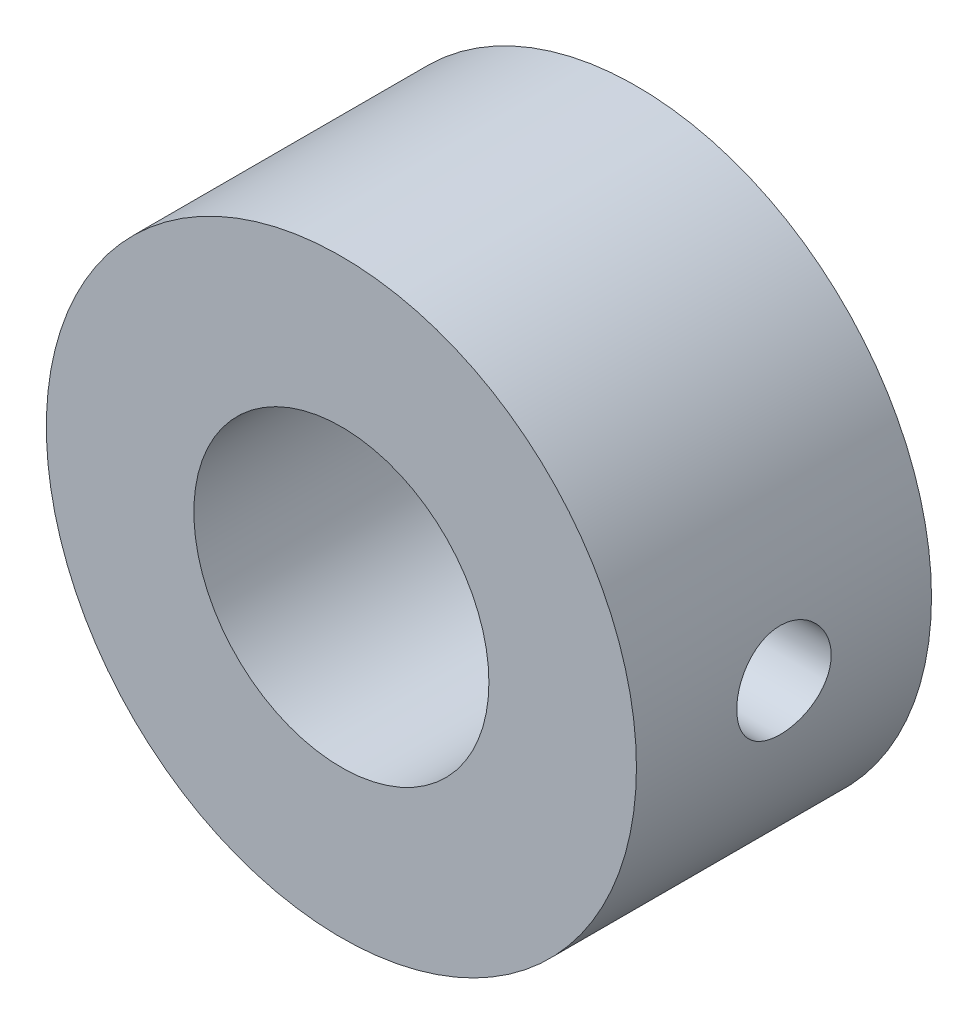
ISO-10303-21;
HEADER;
FILE_DESCRIPTION(('STEP AP214'),'2;1');
FILE_NAME('part.step','',(''),(''),'','','');
FILE_SCHEMA(('AUTOMOTIVE_DESIGN { 1 0 10303 214 1 1 1 1 }'));
ENDSEC;
DATA;
#1=APPLICATION_CONTEXT('core data for automotive mechanical design processes');
#2=APPLICATION_PROTOCOL_DEFINITION('international standard','automotive_design',2000,#1);
#3=PRODUCT_CONTEXT('',#1,'mechanical');
#4=PRODUCT('Part','Part','',(#3));
#5=PRODUCT_RELATED_PRODUCT_CATEGORY('part','',(#4));
#6=PRODUCT_DEFINITION_FORMATION('','',#4);
#7=PRODUCT_DEFINITION_CONTEXT('part definition',#1,'design');
#8=PRODUCT_DEFINITION('design','',#6,#7);
#9=PRODUCT_DEFINITION_SHAPE('','',#8);
#10=(LENGTH_UNIT() NAMED_UNIT(*) SI_UNIT(.MILLI.,.METRE.));
#11=(NAMED_UNIT(*) PLANE_ANGLE_UNIT() SI_UNIT($,.RADIAN.));
#12=(NAMED_UNIT(*) SI_UNIT($,.STERADIAN.) SOLID_ANGLE_UNIT());
#13=UNCERTAINTY_MEASURE_WITH_UNIT(LENGTH_MEASURE(1.E-05),#10,'distance_accuracy_value','');
#14=(GEOMETRIC_REPRESENTATION_CONTEXT(3) GLOBAL_UNCERTAINTY_ASSIGNED_CONTEXT((#13)) GLOBAL_UNIT_ASSIGNED_CONTEXT((#10,
#11,#12)) REPRESENTATION_CONTEXT('',''));
#15=CARTESIAN_POINT('',(0.,0.,0.));
#16=DIRECTION('',(0.,0.,1.));
#17=DIRECTION('',(1.,0.,0.));
#18=AXIS2_PLACEMENT_3D('',#15,#16,#17);
#19=CARTESIAN_POINT('',(0.,0.,2.5));
#20=DIRECTION('',(0.,0.,1.));
#21=DIRECTION('',(1.,0.,0.));
#22=AXIS2_PLACEMENT_3D('',#19,#20,#21);
#23=PLANE('',#22);
#24=CARTESIAN_POINT('',(0.,0.,2.5));
#25=DIRECTION('',(0.,0.,1.));
#26=DIRECTION('',(1.,0.,0.));
#27=AXIS2_PLACEMENT_3D('',#24,#25,#26);
#28=CIRCLE('',#27,5.);
#29=CARTESIAN_POINT('',(5.,0.,2.5));
#30=VERTEX_POINT('',#29);
#31=EDGE_CURVE('E47',#30,#30,#28,.T.);
#32=ORIENTED_EDGE('',*,*,#31,.T.);
#33=EDGE_LOOP('',(#32));
#34=FACE_BOUND('',#33,.T.);
#35=CARTESIAN_POINT('',(0.,0.,2.5));
#36=DIRECTION('',(0.,0.,1.));
#37=DIRECTION('',(1.,0.,0.));
#38=AXIS2_PLACEMENT_3D('',#35,#36,#37);
#39=CIRCLE('',#38,2.5);
#40=CARTESIAN_POINT('',(2.5,0.,2.5));
#41=VERTEX_POINT('',#40);
#42=EDGE_CURVE('E56',#41,#41,#39,.T.);
#43=ORIENTED_EDGE('',*,*,#42,.F.);
#44=EDGE_LOOP('',(#43));
#45=FACE_BOUND('',#44,.T.);
#46=ADVANCED_FACE('F35',(#34,#45),#23,.T.);
#47=CARTESIAN_POINT('',(0.,0.,-2.5));
#48=DIRECTION('',(0.,0.,1.));
#49=DIRECTION('',(1.,0.,0.));
#50=AXIS2_PLACEMENT_3D('',#47,#48,#49);
#51=PLANE('',#50);
#52=CARTESIAN_POINT('',(0.,0.,-2.5));
#53=DIRECTION('',(0.,0.,1.));
#54=DIRECTION('',(1.,0.,0.));
#55=AXIS2_PLACEMENT_3D('',#52,#53,#54);
#56=CIRCLE('',#55,5.);
#57=CARTESIAN_POINT('',(5.,0.,-2.5));
#58=VERTEX_POINT('',#57);
#59=EDGE_CURVE('E51',#58,#58,#56,.T.);
#60=ORIENTED_EDGE('',*,*,#59,.F.);
#61=EDGE_LOOP('',(#60));
#62=FACE_BOUND('',#61,.T.);
#63=CARTESIAN_POINT('',(0.,0.,-2.5));
#64=DIRECTION('',(0.,0.,1.));
#65=DIRECTION('',(1.,0.,0.));
#66=AXIS2_PLACEMENT_3D('',#63,#64,#65);
#67=CIRCLE('',#66,2.5);
#68=CARTESIAN_POINT('',(2.5,0.,-2.5));
#69=VERTEX_POINT('',#68);
#70=EDGE_CURVE('E58',#69,#69,#67,.T.);
#71=ORIENTED_EDGE('',*,*,#70,.T.);
#72=EDGE_LOOP('',(#71));
#73=FACE_BOUND('',#72,.T.);
#74=ADVANCED_FACE('F83',(#62,#73),#51,.F.);
#75=CARTESIAN_POINT('',(0.,0.,2.5));
#76=DIRECTION('',(0.,0.,-1.));
#77=DIRECTION('',(-1.,0.,0.));
#78=AXIS2_PLACEMENT_3D('',#75,#76,#77);
#79=CYLINDRICAL_SURFACE('',#78,5.);
#80=CARTESIAN_POINT('',(5.,0.,0.799999999999993));
#81=CARTESIAN_POINT('',(4.99999925368398,0.0446308080511731,0.799998188547922));
#82=CARTESIAN_POINT('',(4.99939618705492,0.089286609544133,0.796252557082731));
#83=CARTESIAN_POINT('',(4.99704849367426,0.177347511863294,0.781374220920801));
#84=CARTESIAN_POINT('',(4.99530279172417,0.220751394454068,0.770234558439937));
#85=CARTESIAN_POINT('',(4.99086578560516,0.305021508450513,0.740911647821589));
#86=CARTESIAN_POINT('',(4.98817523095935,0.3458897211776,0.722733981551678));
#87=CARTESIAN_POINT('',(4.98214495920462,0.423990337738182,0.679865282240881));
#88=CARTESIAN_POINT('',(4.97880532288342,0.461223193179569,0.655175059646541));
#89=CARTESIAN_POINT('',(4.97181457161351,0.531330998418692,0.599749758295024));
#90=CARTESIAN_POINT('',(4.96816120177215,0.564169146610383,0.568968408421929));
#91=CARTESIAN_POINT('',(4.96097215963753,0.624237641135127,0.502334213090008));
#92=CARTESIAN_POINT('',(4.95743649450599,0.651467646762831,0.466481059732526));
#93=CARTESIAN_POINT('',(4.95086133431278,0.69969266165285,0.390470445539169));
#94=CARTESIAN_POINT('',(4.94782475339399,0.72065159938438,0.350289825055355));
#95=CARTESIAN_POINT('',(4.9426226637982,0.75550892385042,0.266921734852475));
#96=CARTESIAN_POINT('',(4.94045710100136,0.76940774927203,0.223734452145009));
#97=CARTESIAN_POINT('',(4.93726457896946,0.789635034725304,0.135967849254072));
#98=CARTESIAN_POINT('',(4.93622810120145,0.796026817801594,0.091403475619989));
#99=CARTESIAN_POINT('',(4.93538226863645,0.8012548453503,0.00182360516582402));
#100=CARTESIAN_POINT('',(4.93557283377695,0.800091582776763,-0.0431918620298014));
#101=CARTESIAN_POINT('',(4.93715085922415,0.790294188232532,-0.131946012199573));
#102=CARTESIAN_POINT('',(4.93852696316707,0.781730938905651,-0.175692750944414));
#103=CARTESIAN_POINT('',(4.94230325280695,0.757487774055355,-0.261120428439182));
#104=CARTESIAN_POINT('',(4.944703471104,0.74180763198268,-0.302801301380358));
#105=CARTESIAN_POINT('',(4.95026992730641,0.70370315498882,-0.383127707142337));
#106=CARTESIAN_POINT('',(4.95343952372276,0.681249143270032,-0.421758919874148));
#107=CARTESIAN_POINT('',(4.96018523245969,0.630255410529446,-0.49473210867413));
#108=CARTESIAN_POINT('',(4.96376137506045,0.601715236062142,-0.52907376484927));
#109=CARTESIAN_POINT('',(4.97096724981016,0.538971936351564,-0.592903520174933));
#110=CARTESIAN_POINT('',(4.97459712801084,0.504707942182392,-0.62233180282751));
#111=CARTESIAN_POINT('',(4.98146370833866,0.431696149872206,-0.675029895537198));
#112=CARTESIAN_POINT('',(4.98470040828701,0.392948326886549,-0.698299671468023));
#113=CARTESIAN_POINT('',(4.99042002279776,0.312014355323645,-0.738024671245587));
#114=CARTESIAN_POINT('',(4.99290238302826,0.26982570696861,-0.75447488690754));
#115=CARTESIAN_POINT('',(4.9968291023744,0.183235933575907,-0.780039743170398));
#116=CARTESIAN_POINT('',(4.99827354143846,0.138834979228291,-0.789154948774821));
#117=CARTESIAN_POINT('',(4.99995098582024,0.0495968221607872,-0.799710588005176));
#118=CARTESIAN_POINT('',(5.00019695987027,0.00476957346417478,-0.801233186383058));
#119=CARTESIAN_POINT('',(4.99948519003732,-0.0844997486044568,-0.796779047356288));
#120=CARTESIAN_POINT('',(4.9985274887222,-0.128941835541714,-0.790802575155455));
#121=CARTESIAN_POINT('',(4.99552400060935,-0.215927519294201,-0.771588280724297));
#122=CARTESIAN_POINT('',(4.99348427121022,-0.258480269760831,-0.758390869878175));
#123=CARTESIAN_POINT('',(4.98854458459104,-0.340769196234395,-0.725152212587975));
#124=CARTESIAN_POINT('',(4.98564458225813,-0.380505224396474,-0.705110607224756));
#125=CARTESIAN_POINT('',(4.97927408607371,-0.456391460451544,-0.65856240027867));
#126=CARTESIAN_POINT('',(4.97579911023324,-0.492509601238277,-0.632004145590766));
#127=CARTESIAN_POINT('',(4.96867838165483,-0.559805662558109,-0.57324793825499));
#128=CARTESIAN_POINT('',(4.96503261755335,-0.590983253761126,-0.541049609948693));
#129=CARTESIAN_POINT('',(4.95793961092294,-0.647815466119997,-0.471559844758413));
#130=CARTESIAN_POINT('',(4.95449458581512,-0.673414749658874,-0.434222888485269));
#131=CARTESIAN_POINT('',(4.94823364120698,-0.717977956840472,-0.355730487551863));
#132=CARTESIAN_POINT('',(4.94541770293382,-0.736942078495335,-0.314575156889158));
#133=CARTESIAN_POINT('',(4.94075016481912,-0.76761263341661,-0.229773216312712));
#134=CARTESIAN_POINT('',(4.9388948235089,-0.779347259610058,-0.186137018160851));
#135=CARTESIAN_POINT('',(4.93634892888289,-0.795314874217832,-0.0974809720031934));
#136=CARTESIAN_POINT('',(4.93565828296954,-0.799548458993811,-0.0524612342836637));
#137=CARTESIAN_POINT('',(4.93552375034277,-0.80037818647357,0.0371317973746478));
#138=CARTESIAN_POINT('',(4.93606565128661,-0.797061391285779,0.0817042878159039));
#139=CARTESIAN_POINT('',(4.93830411303284,-0.783072071891894,0.169648529050889));
#140=CARTESIAN_POINT('',(4.9400006709115,-0.772399566311442,0.213020282884755));
#141=CARTESIAN_POINT('',(4.94435206344804,-0.744034087420246,0.297302140006585));
#142=CARTESIAN_POINT('',(4.94700595372412,-0.726348031080528,0.338214623056524));
#143=CARTESIAN_POINT('',(4.95297399069632,-0.684466309136969,0.416505787069226));
#144=CARTESIAN_POINT('',(4.95628816589566,-0.660270362498023,0.453884315375289));
#145=CARTESIAN_POINT('',(4.96324867230805,-0.605742654398702,0.524487432334613));
#146=CARTESIAN_POINT('',(4.96689824087121,-0.575346658323831,0.557662099160161));
#147=CARTESIAN_POINT('',(4.97409200519902,-0.509417337431806,0.618470152559004));
#148=CARTESIAN_POINT('',(4.97763617638799,-0.473882825608014,0.646102255259478));
#149=CARTESIAN_POINT('',(4.9842456225166,-0.39841933863093,0.69519898646872));
#150=CARTESIAN_POINT('',(4.98730773061183,-0.358464019917935,0.716623549554953));
#151=CARTESIAN_POINT('',(4.99257715001872,-0.27549006678746,0.752424517159625));
#152=CARTESIAN_POINT('',(4.99478532624932,-0.232474584483899,0.766808057241583));
#153=CARTESIAN_POINT('',(4.99760702358556,-0.157734207535214,0.784938295494183));
#154=CARTESIAN_POINT('',(4.9984996711327,-0.126465390999475,0.790577561117113));
#155=CARTESIAN_POINT('',(4.99969642026856,-0.0634685920606806,0.798109029145436));
#156=CARTESIAN_POINT('',(5.00000053076634,-0.0317406166155306,0.800001288271665));
#157=CARTESIAN_POINT('',(5.,0.,0.799999999999993));
#158=B_SPLINE_CURVE_WITH_KNOTS('',3,(#80,#81,#82,#83,#84,#85,#86,#87,#88,#89,#90,#91,#92,#93,
#94,#95,#96,#97,#98,#99,#100,#101,#102,#103,#104,#105,#106,#107,#108,#109,#110,#111,#112,#113,
#114,#115,#116,#117,#118,#119,#120,#121,#122,#123,#124,#125,#126,#127,#128,#129,#130,#131,#132,
#133,#134,#135,#136,#137,#138,#139,#140,#141,#142,#143,#144,#145,#146,#147,#148,#149,#150,#151,
#152,#153,#154,#155,#156,#157),.UNSPECIFIED.,.T.,.F.,(4,2,2,2,2,2,2,2,2,2,2,2,2,2,2,2,2,2,2,2,2,
2,2,2,2,2,2,2,2,2,2,2,2,2,2,2,2,2,4),(0.,0.133776418649177,0.267678899727785,0.401475399062738,
0.535255256116411,0.67009333843293,0.804939610005115,0.940547238503773,1.07614643985654,
1.21059343387859,1.34503165554809,1.47819622356199,1.61136503084876,1.74512594827326,
1.87889683494992,2.01419325334954,2.14949042145486,2.28488677454406,2.42027269728076,
2.55419028860043,2.68810314407251,2.82127412090817,2.954452082489,3.08872183713535,
3.22300053825305,3.35855610834639,3.49410763273005,3.62912714304123,3.76413591830007,
3.89759582738453,4.0310553985319,4.16438367394701,4.2977177061319,4.43251052341615,
4.5673345279789,4.7030102746009,4.83854823761402,4.9336890266799,5.02882837552775),.UNSPECIFIED.);
#159=CARTESIAN_POINT('',(5.,0.,0.799999999999993));
#160=VERTEX_POINT('',#159);
#161=EDGE_CURVE('E10',#160,#160,#158,.T.);
#162=ORIENTED_EDGE('',*,*,#161,.T.);
#163=EDGE_LOOP('',(#162));
#164=FACE_BOUND('',#163,.T.);
#165=ORIENTED_EDGE('',*,*,#31,.F.);
#166=EDGE_LOOP('',(#165));
#167=FACE_BOUND('',#166,.T.);
#168=ORIENTED_EDGE('',*,*,#59,.T.);
#169=EDGE_LOOP('',(#168));
#170=FACE_BOUND('',#169,.T.);
#171=ADVANCED_FACE('F37',(#164,#167,#170),#79,.T.);
#172=CARTESIAN_POINT('',(0.,0.,2.5));
#173=DIRECTION('',(0.,0.,-1.));
#174=DIRECTION('',(-1.,0.,0.));
#175=AXIS2_PLACEMENT_3D('',#172,#173,#174);
#176=CYLINDRICAL_SURFACE('',#175,2.5);
#177=CARTESIAN_POINT('',(2.5,0.,0.799999999999993));
#178=CARTESIAN_POINT('',(2.49999989271814,0.0437479031579896,0.799999878174701));
#179=CARTESIAN_POINT('',(2.4988409207818,0.0874973185295298,0.796399702360364));
#180=CARTESIAN_POINT('',(2.49433131086111,0.17371345061874,0.782134090235364));
#181=CARTESIAN_POINT('',(2.4909802727677,0.216179931686852,0.771467364091042));
#182=CARTESIAN_POINT('',(2.48245191817715,0.298574612895781,0.743467539394104));
#183=CARTESIAN_POINT('',(2.47727751022632,0.338506736692297,0.726145053814677));
#184=CARTESIAN_POINT('',(2.465634508214,0.414899381425573,0.685371584956378));
#185=CARTESIAN_POINT('',(2.45916569150058,0.451359303512461,0.661919547117244));
#186=CARTESIAN_POINT('',(2.44538533967052,0.520947378897494,0.608757943247923));
#187=CARTESIAN_POINT('',(2.43805478866985,0.553948046123227,0.578886450523072));
#188=CARTESIAN_POINT('',(2.42348532851009,0.614567118466103,0.514078466726504));
#189=CARTESIAN_POINT('',(2.41624643774199,0.642184458968865,0.479140976173354));
#190=CARTESIAN_POINT('',(2.40247405401532,0.691956975369269,0.40407357274399));
#191=CARTESIAN_POINT('',(2.39596392825326,0.713950615550156,0.36383185936165));
#192=CARTESIAN_POINT('',(2.38467328891707,0.750804585672501,0.279978828118017));
#193=CARTESIAN_POINT('',(2.37989229455565,0.765666898864973,0.236368451017323));
#194=CARTESIAN_POINT('',(2.3728006140792,0.787365671556013,0.14845869636131));
#195=CARTESIAN_POINT('',(2.37041707567794,0.794439484234909,0.104223949101231));
#196=CARTESIAN_POINT('',(2.3681741562335,0.801102165297518,0.0151362003803353));
#197=CARTESIAN_POINT('',(2.3683140664017,0.800693135468622,-0.029716623937612));
#198=CARTESIAN_POINT('',(2.37103809524654,0.79258690368103,-0.116782792441988));
#199=CARTESIAN_POINT('',(2.37352008708405,0.785194210663384,-0.159028226721779));
#200=CARTESIAN_POINT('',(2.38048228729887,0.763825294870921,-0.241644422211601));
#201=CARTESIAN_POINT('',(2.38496271746849,0.749848341346692,-0.282014974792752));
#202=CARTESIAN_POINT('',(2.39549327079956,0.715498225793991,-0.360448929412712));
#203=CARTESIAN_POINT('',(2.40156614734181,0.695031365518589,-0.398468109975693));
#204=CARTESIAN_POINT('',(2.41458722431085,0.648347471670349,-0.470631021513422));
#205=CARTESIAN_POINT('',(2.42153566107407,0.622128884135773,-0.504773701371776));
#206=CARTESIAN_POINT('',(2.43593186070792,0.563202757701924,-0.569932336433125));
#207=CARTESIAN_POINT('',(2.44338760404052,0.530244681247005,-0.600720388469399));
#208=CARTESIAN_POINT('',(2.45766584057477,0.459540716108571,-0.656389339116822));
#209=CARTESIAN_POINT('',(2.46448828216864,0.421794437826344,-0.681269756571442));
#210=CARTESIAN_POINT('',(2.47680894872282,0.342130790356183,-0.724581721640106));
#211=CARTESIAN_POINT('',(2.48229540273968,0.300180639720314,-0.74295655041821));
#212=CARTESIAN_POINT('',(2.49124080550101,0.213567925180563,-0.772319798331348));
#213=CARTESIAN_POINT('',(2.49470040102319,0.168906231565772,-0.783310573908352));
#214=CARTESIAN_POINT('',(2.49909712119567,0.0800708947946578,-0.797200033332601));
#215=CARTESIAN_POINT('',(2.50013030089079,0.0359501430085353,-0.800407036805542));
#216=CARTESIAN_POINT('',(2.4998432765922,-0.0522051347940525,-0.799510390889343));
#217=CARTESIAN_POINT('',(2.49852343502096,-0.0962396730437174,-0.795407867345058));
#218=CARTESIAN_POINT('',(2.49374190158755,-0.181767509101907,-0.780254943459405));
#219=CARTESIAN_POINT('',(2.49033743324659,-0.223297181239018,-0.769390044957022));
#220=CARTESIAN_POINT('',(2.48178792997649,-0.303930827300281,-0.741249100301887));
#221=CARTESIAN_POINT('',(2.47664267719677,-0.34303449689703,-0.72397225169898));
#222=CARTESIAN_POINT('',(2.46497765510051,-0.418798461935251,-0.683014491410841));
#223=CARTESIAN_POINT('',(2.45842663135416,-0.455372810250599,-0.659183744028553));
#224=CARTESIAN_POINT('',(2.44469704119869,-0.524105751503187,-0.605973063507466));
#225=CARTESIAN_POINT('',(2.43751829714654,-0.556263087776544,-0.576591556771923));
#226=CARTESIAN_POINT('',(2.42296483643062,-0.616641607443633,-0.511662920193389));
#227=CARTESIAN_POINT('',(2.41559442088859,-0.644642897379854,-0.475909866151472));
#228=CARTESIAN_POINT('',(2.40180221549581,-0.694270709961084,-0.400052662775171));
#229=CARTESIAN_POINT('',(2.39538041783048,-0.715897285121637,-0.359948549288976));
#230=CARTESIAN_POINT('',(2.38428131463807,-0.752037901510555,-0.27657821066094));
#231=CARTESIAN_POINT('',(2.37959828486359,-0.766575331558161,-0.233322932455967));
#232=CARTESIAN_POINT('',(2.37255640915948,-0.788103341251955,-0.144796395041385));
#233=CARTESIAN_POINT('',(2.37019662268833,-0.795096975037384,-0.0995259594124566));
#234=CARTESIAN_POINT('',(2.3681696394894,-0.801112676553487,-0.010562015436565));
#235=CARTESIAN_POINT('',(2.36838009604105,-0.80049694223209,0.0331045056403989));
#236=CARTESIAN_POINT('',(2.37117079614515,-0.792191775751239,0.11967850270165));
#237=CARTESIAN_POINT('',(2.37375091885334,-0.784502704305886,0.162586017278744));
#238=CARTESIAN_POINT('',(2.38090271554525,-0.762516662080642,0.245741712695377));
#239=CARTESIAN_POINT('',(2.38544163613637,-0.74832813971308,0.286021599448295));
#240=CARTESIAN_POINT('',(2.39598987801927,-0.713832137422348,0.363660880198543));
#241=CARTESIAN_POINT('',(2.40199950851255,-0.693523370573243,0.40101965788084));
#242=CARTESIAN_POINT('',(2.4151174718284,-0.646396333537028,0.473404814907731));
#243=CARTESIAN_POINT('',(2.42226059525979,-0.619346542157852,0.508274131367161));
#244=CARTESIAN_POINT('',(2.43668590424039,-0.55990699896445,0.573095872910335));
#245=CARTESIAN_POINT('',(2.44396812723446,-0.527515790834119,0.60304695259928));
#246=CARTESIAN_POINT('',(2.45815554099957,-0.456956105149161,0.658229142961952));
#247=CARTESIAN_POINT('',(2.46503875940166,-0.418625675880383,0.683259475942158));
#248=CARTESIAN_POINT('',(2.47736893848957,-0.338081764963467,0.726490094048597));
#249=CARTESIAN_POINT('',(2.48281639535654,-0.295869631604075,0.744692739660389));
#250=CARTESIAN_POINT('',(2.49134170532026,-0.211831715822419,0.772623889915216));
#251=CARTESIAN_POINT('',(2.49455950650724,-0.170188383243662,0.782859225291549));
#252=CARTESIAN_POINT('',(2.49888846770699,-0.0856970005380585,0.796546571451999));
#253=CARTESIAN_POINT('',(2.50000010507806,-0.0428492256306968,0.800000119322728));
#254=CARTESIAN_POINT('',(2.5,0.,0.799999999999993));
#255=B_SPLINE_CURVE_WITH_KNOTS('',3,(#177,#178,#179,#180,#181,#182,#183,#184,#185,#186,#187,
#188,#189,#190,#191,#192,#193,#194,#195,#196,#197,#198,#199,#200,#201,#202,#203,#204,#205,#206,
#207,#208,#209,#210,#211,#212,#213,#214,#215,#216,#217,#218,#219,#220,#221,#222,#223,#224,#225,
#226,#227,#228,#229,#230,#231,#232,#233,#234,#235,#236,#237,#238,#239,#240,#241,#242,#243,#244,
#245,#246,#247,#248,#249,#250,#251,#252,#253,#254),.UNSPECIFIED.,.T.,.F.,(4,2,2,2,2,2,2,2,2,2,2,
2,2,2,2,2,2,2,2,2,2,2,2,2,2,2,2,2,2,2,2,2,2,2,2,2,2,2,4),(0.,0.131086144933243,0.26219622317418,
0.393098101055853,0.524022514823511,0.658748590757829,0.793501283342123,0.931774144133125,
1.07000852835976,1.20390244997007,1.33775876391535,1.46603544670146,1.59432636953813,
1.72456097961805,1.85483081900928,1.99133642398735,2.12785314306701,2.2655323566152,
2.40316761227597,2.53525505290095,2.66732215060772,2.79591708188317,2.92452811213589,
3.05636677521963,3.18824286976831,3.32561496520952,3.46298592893393,3.5999005533035,
3.73675972635385,3.86713067475703,3.99749497509132,4.12575911428296,4.2540502428799,
4.38756878325599,4.52112378730429,4.65933142753267,4.79749124212502,4.92591370140311,
5.05430705047444),.UNSPECIFIED.);
#256=CARTESIAN_POINT('',(2.5,0.,0.799999999999993));
#257=VERTEX_POINT('',#256);
#258=EDGE_CURVE('E61',#257,#257,#255,.T.);
#259=ORIENTED_EDGE('',*,*,#258,.F.);
#260=EDGE_LOOP('',(#259));
#261=FACE_BOUND('',#260,.T.);
#262=ORIENTED_EDGE('',*,*,#42,.T.);
#263=EDGE_LOOP('',(#262));
#264=FACE_BOUND('',#263,.T.);
#265=ORIENTED_EDGE('',*,*,#70,.F.);
#266=EDGE_LOOP('',(#265));
#267=FACE_BOUND('',#266,.T.);
#268=ADVANCED_FACE('F69',(#261,#264,#267),#176,.F.);
#269=CARTESIAN_POINT('',(0.,0.,0.));
#270=DIRECTION('',(-1.,0.,0.));
#271=DIRECTION('',(0.,0.,1.));
#272=AXIS2_PLACEMENT_3D('',#269,#270,#271);
#273=CYLINDRICAL_SURFACE('',#272,0.799999999999993);
#274=ORIENTED_EDGE('',*,*,#258,.T.);
#275=EDGE_LOOP('',(#274));
#276=FACE_BOUND('',#275,.T.);
#277=ORIENTED_EDGE('',*,*,#161,.F.);
#278=EDGE_LOOP('',(#277));
#279=FACE_BOUND('',#278,.T.);
#280=ADVANCED_FACE('F72',(#276,#279),#273,.F.);
#281=CLOSED_SHELL('',(#46,#74,#171,#268,#280));
#282=MANIFOLD_SOLID_BREP('B2',#281);
#283=ADVANCED_BREP_SHAPE_REPRESENTATION('',(#18,#282),#14);
#284=SHAPE_DEFINITION_REPRESENTATION(#9,#283);
ENDSEC;
END-ISO-10303-21;
